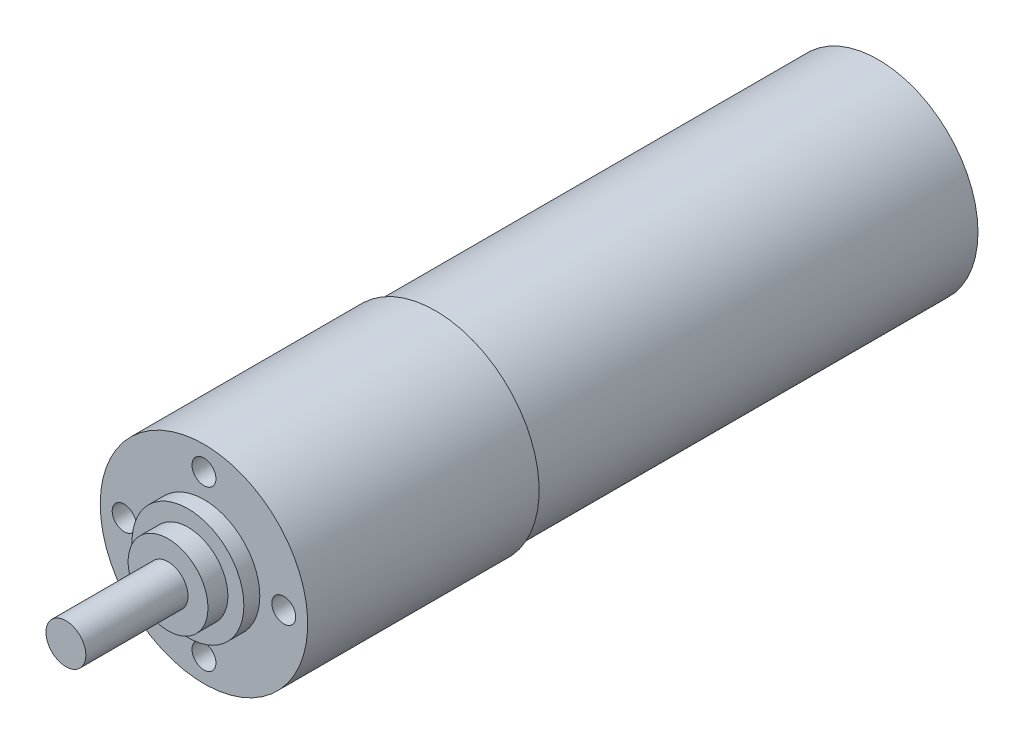
ISO-10303-21;
HEADER;
FILE_DESCRIPTION(('STEP AP214'),'2;1');
FILE_NAME('part.step','',(''),(''),'','','');
FILE_SCHEMA(('AUTOMOTIVE_DESIGN { 1 0 10303 214 1 1 1 1 }'));
ENDSEC;
DATA;
#1=APPLICATION_CONTEXT('core data for automotive mechanical design processes');
#2=APPLICATION_PROTOCOL_DEFINITION('international standard','automotive_design',2000,#1);
#3=PRODUCT_CONTEXT('',#1,'mechanical');
#4=PRODUCT('Part','Part','',(#3));
#5=PRODUCT_RELATED_PRODUCT_CATEGORY('part','',(#4));
#6=PRODUCT_DEFINITION_FORMATION('','',#4);
#7=PRODUCT_DEFINITION_CONTEXT('part definition',#1,'design');
#8=PRODUCT_DEFINITION('design','',#6,#7);
#9=PRODUCT_DEFINITION_SHAPE('','',#8);
#10=(LENGTH_UNIT() NAMED_UNIT(*) SI_UNIT(.MILLI.,.METRE.));
#11=(NAMED_UNIT(*) PLANE_ANGLE_UNIT() SI_UNIT($,.RADIAN.));
#12=(NAMED_UNIT(*) SI_UNIT($,.STERADIAN.) SOLID_ANGLE_UNIT());
#13=UNCERTAINTY_MEASURE_WITH_UNIT(LENGTH_MEASURE(1.E-05),#10,'distance_accuracy_value','');
#14=(GEOMETRIC_REPRESENTATION_CONTEXT(3) GLOBAL_UNCERTAINTY_ASSIGNED_CONTEXT((#13)) GLOBAL_UNIT_ASSIGNED_CONTEXT((#10,
#11,#12)) REPRESENTATION_CONTEXT('',''));
#15=CARTESIAN_POINT('',(0.,0.,0.));
#16=DIRECTION('',(0.,0.,1.));
#17=DIRECTION('',(1.,0.,0.));
#18=AXIS2_PLACEMENT_3D('',#15,#16,#17);
#19=CARTESIAN_POINT('',(0.,0.,89.));
#20=DIRECTION('',(0.,0.,1.));
#21=DIRECTION('',(1.,0.,0.));
#22=AXIS2_PLACEMENT_3D('',#19,#20,#21);
#23=PLANE('',#22);
#24=CARTESIAN_POINT('',(0.,0.,89.));
#25=DIRECTION('',(0.,0.,1.));
#26=DIRECTION('',(1.,0.,0.));
#27=AXIS2_PLACEMENT_3D('',#24,#25,#26);
#28=CIRCLE('',#27,5.);
#29=CARTESIAN_POINT('',(5.,0.,89.));
#30=VERTEX_POINT('',#29);
#31=EDGE_CURVE('E55',#30,#30,#28,.T.);
#32=ORIENTED_EDGE('',*,*,#31,.T.);
#33=EDGE_LOOP('',(#32));
#34=FACE_BOUND('',#33,.T.);
#35=CARTESIAN_POINT('',(0.,0.,89.));
#36=DIRECTION('',(0.,0.,1.));
#37=DIRECTION('',(1.,0.,0.));
#38=AXIS2_PLACEMENT_3D('',#35,#36,#37);
#39=CIRCLE('',#38,2.5);
#40=CARTESIAN_POINT('',(2.5,0.,89.));
#41=VERTEX_POINT('',#40);
#42=EDGE_CURVE('E64',#41,#41,#39,.T.);
#43=ORIENTED_EDGE('',*,*,#42,.F.);
#44=EDGE_LOOP('',(#43));
#45=FACE_BOUND('',#44,.T.);
#46=ADVANCED_FACE('F33',(#34,#45),#23,.T.);
#47=CARTESIAN_POINT('',(0.,0.,86.5));
#48=DIRECTION('',(0.,0.,1.));
#49=DIRECTION('',(1.,0.,0.));
#50=AXIS2_PLACEMENT_3D('',#47,#48,#49);
#51=PLANE('',#50);
#52=CARTESIAN_POINT('',(0.,0.,86.5));
#53=DIRECTION('',(0.,0.,1.));
#54=DIRECTION('',(1.,0.,0.));
#55=AXIS2_PLACEMENT_3D('',#52,#53,#54);
#56=CIRCLE('',#55,7.);
#57=CARTESIAN_POINT('',(7.,0.,86.5));
#58=VERTEX_POINT('',#57);
#59=EDGE_CURVE('E49',#58,#58,#56,.T.);
#60=ORIENTED_EDGE('',*,*,#59,.T.);
#61=EDGE_LOOP('',(#60));
#62=FACE_BOUND('',#61,.T.);
#63=CARTESIAN_POINT('',(0.,0.,86.5));
#64=DIRECTION('',(0.,0.,1.));
#65=DIRECTION('',(1.,0.,0.));
#66=AXIS2_PLACEMENT_3D('',#63,#64,#65);
#67=CIRCLE('',#66,5.);
#68=CARTESIAN_POINT('',(5.,0.,86.5));
#69=VERTEX_POINT('',#68);
#70=EDGE_CURVE('E58',#69,#69,#67,.T.);
#71=ORIENTED_EDGE('',*,*,#70,.F.);
#72=EDGE_LOOP('',(#71));
#73=FACE_BOUND('',#72,.T.);
#74=ADVANCED_FACE('F106',(#62,#73),#51,.T.);
#75=CARTESIAN_POINT('',(0.,0.,84.5));
#76=DIRECTION('',(0.,0.,1.));
#77=DIRECTION('',(1.,0.,0.));
#78=AXIS2_PLACEMENT_3D('',#75,#76,#77);
#79=PLANE('',#78);
#80=CARTESIAN_POINT('',(-9.99999999999972,-2.8421709430404E-13,84.5));
#81=DIRECTION('',(0.,0.,1.));
#82=DIRECTION('',(1.,0.,0.));
#83=AXIS2_PLACEMENT_3D('',#80,#81,#82);
#84=CIRCLE('',#83,1.50000000000045);
#85=CARTESIAN_POINT('',(-8.49999999999926,-2.8421709430404E-13,84.5));
#86=VERTEX_POINT('',#85);
#87=EDGE_CURVE('E88',#86,#86,#84,.T.);
#88=ORIENTED_EDGE('',*,*,#87,.F.);
#89=EDGE_LOOP('',(#88));
#90=FACE_BOUND('',#89,.T.);
#91=CARTESIAN_POINT('',(5.65984895009786E-13,-10.,84.5));
#92=DIRECTION('',(0.,0.,1.));
#93=DIRECTION('',(1.,0.,0.));
#94=AXIS2_PLACEMENT_3D('',#91,#92,#93);
#95=CIRCLE('',#94,1.50000000000061);
#96=CARTESIAN_POINT('',(1.50000000000117,-10.,84.5));
#97=VERTEX_POINT('',#96);
#98=EDGE_CURVE('E82',#97,#97,#95,.T.);
#99=ORIENTED_EDGE('',*,*,#98,.F.);
#100=EDGE_LOOP('',(#99));
#101=FACE_BOUND('',#100,.T.);
#102=CARTESIAN_POINT('',(10.0000000000003,2.82992447504893E-13,84.5));
#103=DIRECTION('',(0.,0.,1.));
#104=DIRECTION('',(1.,0.,0.));
#105=AXIS2_PLACEMENT_3D('',#102,#103,#104);
#106=CIRCLE('',#105,1.50000000000022);
#107=CARTESIAN_POINT('',(11.5000000000005,2.82992447504893E-13,84.5));
#108=VERTEX_POINT('',#107);
#109=EDGE_CURVE('E76',#108,#108,#106,.T.);
#110=ORIENTED_EDGE('',*,*,#109,.F.);
#111=EDGE_LOOP('',(#110));
#112=FACE_BOUND('',#111,.T.);
#113=CARTESIAN_POINT('',(0.,10.,84.5));
#114=DIRECTION('',(0.,0.,1.));
#115=DIRECTION('',(1.,0.,0.));
#116=AXIS2_PLACEMENT_3D('',#113,#114,#115);
#117=CIRCLE('',#116,1.5);
#118=CARTESIAN_POINT('',(1.5,10.,84.5));
#119=VERTEX_POINT('',#118);
#120=EDGE_CURVE('E70',#119,#119,#117,.T.);
#121=ORIENTED_EDGE('',*,*,#120,.F.);
#122=EDGE_LOOP('',(#121));
#123=FACE_BOUND('',#122,.T.);
#124=CARTESIAN_POINT('',(0.,0.,84.5));
#125=DIRECTION('',(0.,0.,1.));
#126=DIRECTION('',(1.,0.,0.));
#127=AXIS2_PLACEMENT_3D('',#124,#125,#126);
#128=CIRCLE('',#127,13.);
#129=CARTESIAN_POINT('',(-13.,0.,84.5));
#130=VERTEX_POINT('',#129);
#131=EDGE_CURVE('E44',#130,#130,#128,.T.);
#132=ORIENTED_EDGE('',*,*,#131,.T.);
#133=EDGE_LOOP('',(#132));
#134=FACE_BOUND('',#133,.T.);
#135=CARTESIAN_POINT('',(0.,0.,84.5));
#136=DIRECTION('',(0.,0.,1.));
#137=DIRECTION('',(1.,0.,0.));
#138=AXIS2_PLACEMENT_3D('',#135,#136,#137);
#139=CIRCLE('',#138,7.);
#140=CARTESIAN_POINT('',(7.,0.,84.5));
#141=VERTEX_POINT('',#140);
#142=EDGE_CURVE('E52',#141,#141,#139,.T.);
#143=ORIENTED_EDGE('',*,*,#142,.F.);
#144=EDGE_LOOP('',(#143));
#145=FACE_BOUND('',#144,.T.);
#146=ADVANCED_FACE('F103',(#90,#101,#112,#123,#134,#145),#79,.T.);
#147=CARTESIAN_POINT('',(0.,0.,55.5));
#148=DIRECTION('',(0.,0.,-1.));
#149=DIRECTION('',(-1.,0.,0.));
#150=AXIS2_PLACEMENT_3D('',#147,#148,#149);
#151=CYLINDRICAL_SURFACE('',#150,12.5);
#152=CARTESIAN_POINT('',(0.,0.,55.5));
#153=DIRECTION('',(0.,0.,1.));
#154=DIRECTION('',(1.,0.,0.));
#155=AXIS2_PLACEMENT_3D('',#152,#153,#154);
#156=CIRCLE('',#155,12.5);
#157=CARTESIAN_POINT('',(12.5,0.,55.5));
#158=VERTEX_POINT('',#157);
#159=EDGE_CURVE('E10',#158,#158,#156,.T.);
#160=ORIENTED_EDGE('',*,*,#159,.F.);
#161=EDGE_LOOP('',(#160));
#162=FACE_BOUND('',#161,.T.);
#163=CARTESIAN_POINT('',(0.,0.,0.));
#164=DIRECTION('',(0.,0.,1.));
#165=DIRECTION('',(1.,0.,0.));
#166=AXIS2_PLACEMENT_3D('',#163,#164,#165);
#167=CIRCLE('',#166,12.5);
#168=CARTESIAN_POINT('',(12.5,0.,0.));
#169=VERTEX_POINT('',#168);
#170=EDGE_CURVE('E37',#169,#169,#167,.T.);
#171=ORIENTED_EDGE('',*,*,#170,.T.);
#172=EDGE_LOOP('',(#171));
#173=FACE_BOUND('',#172,.T.);
#174=ADVANCED_FACE('F35',(#162,#173),#151,.T.);
#175=CARTESIAN_POINT('',(0.,0.,0.));
#176=DIRECTION('',(0.,0.,1.));
#177=DIRECTION('',(1.,0.,0.));
#178=AXIS2_PLACEMENT_3D('',#175,#176,#177);
#179=PLANE('',#178);
#180=ORIENTED_EDGE('',*,*,#170,.F.);
#181=EDGE_LOOP('',(#180));
#182=FACE_BOUND('',#181,.T.);
#183=ADVANCED_FACE('F269',(#182),#179,.F.);
#184=CARTESIAN_POINT('',(0.,0.,55.5));
#185=DIRECTION('',(0.,0.,1.));
#186=DIRECTION('',(1.,0.,0.));
#187=AXIS2_PLACEMENT_3D('',#184,#185,#186);
#188=PLANE('',#187);
#189=CARTESIAN_POINT('',(0.,0.,55.5));
#190=DIRECTION('',(0.,0.,1.));
#191=DIRECTION('',(1.,0.,0.));
#192=AXIS2_PLACEMENT_3D('',#189,#190,#191);
#193=CIRCLE('',#192,13.);
#194=CARTESIAN_POINT('',(-13.,0.,55.5));
#195=VERTEX_POINT('',#194);
#196=EDGE_CURVE('E46',#195,#195,#193,.T.);
#197=ORIENTED_EDGE('',*,*,#196,.F.);
#198=EDGE_LOOP('',(#197));
#199=FACE_BOUND('',#198,.T.);
#200=ORIENTED_EDGE('',*,*,#159,.T.);
#201=EDGE_LOOP('',(#200));
#202=FACE_BOUND('',#201,.T.);
#203=ADVANCED_FACE('F131',(#199,#202),#188,.F.);
#204=CARTESIAN_POINT('',(0.,0.,84.5));
#205=DIRECTION('',(0.,0.,-1.));
#206=DIRECTION('',(-1.,0.,0.));
#207=AXIS2_PLACEMENT_3D('',#204,#205,#206);
#208=CYLINDRICAL_SURFACE('',#207,13.);
#209=CARTESIAN_POINT('',(-13.,0.,84.5));
#210=CARTESIAN_POINT('',(-13.,0.,84.1979166666667));
#211=CARTESIAN_POINT('',(-13.,0.,83.8958333333333));
#212=CARTESIAN_POINT('',(-13.,0.,83.2916666666667));
#213=CARTESIAN_POINT('',(-13.,0.,82.9895833333333));
#214=CARTESIAN_POINT('',(-13.,0.,82.3854166666667));
#215=CARTESIAN_POINT('',(-13.,0.,82.0833333333333));
#216=CARTESIAN_POINT('',(-13.,0.,81.4791666666667));
#217=CARTESIAN_POINT('',(-13.,0.,81.1770833333333));
#218=CARTESIAN_POINT('',(-13.,0.,80.5729166666667));
#219=CARTESIAN_POINT('',(-13.,0.,80.2708333333333));
#220=CARTESIAN_POINT('',(-13.,0.,79.6666666666667));
#221=CARTESIAN_POINT('',(-13.,0.,79.3645833333333));
#222=CARTESIAN_POINT('',(-13.,0.,78.7604166666667));
#223=CARTESIAN_POINT('',(-13.,0.,78.4583333333333));
#224=CARTESIAN_POINT('',(-13.,0.,77.8541666666667));
#225=CARTESIAN_POINT('',(-13.,0.,77.5520833333333));
#226=CARTESIAN_POINT('',(-13.,0.,76.9479166666667));
#227=CARTESIAN_POINT('',(-13.,0.,76.6458333333333));
#228=CARTESIAN_POINT('',(-13.,0.,76.0416666666667));
#229=CARTESIAN_POINT('',(-13.,0.,75.7395833333333));
#230=CARTESIAN_POINT('',(-13.,0.,75.1354166666667));
#231=CARTESIAN_POINT('',(-13.,0.,74.8333333333333));
#232=CARTESIAN_POINT('',(-13.,0.,74.2291666666667));
#233=CARTESIAN_POINT('',(-13.,0.,73.9270833333333));
#234=CARTESIAN_POINT('',(-13.,0.,73.3229166666667));
#235=CARTESIAN_POINT('',(-13.,0.,73.0208333333333));
#236=CARTESIAN_POINT('',(-13.,0.,72.4166666666667));
#237=CARTESIAN_POINT('',(-13.,0.,72.1145833333333));
#238=CARTESIAN_POINT('',(-13.,0.,71.5104166666667));
#239=CARTESIAN_POINT('',(-13.,0.,71.2083333333333));
#240=CARTESIAN_POINT('',(-13.,0.,70.6041666666667));
#241=CARTESIAN_POINT('',(-13.,0.,70.3020833333333));
#242=CARTESIAN_POINT('',(-13.,0.,69.6979166666667));
#243=CARTESIAN_POINT('',(-13.,0.,69.3958333333333));
#244=CARTESIAN_POINT('',(-13.,0.,68.7916666666667));
#245=CARTESIAN_POINT('',(-13.,0.,68.4895833333333));
#246=CARTESIAN_POINT('',(-13.,0.,67.8854166666667));
#247=CARTESIAN_POINT('',(-13.,0.,67.5833333333333));
#248=CARTESIAN_POINT('',(-13.,0.,66.9791666666667));
#249=CARTESIAN_POINT('',(-13.,0.,66.6770833333333));
#250=CARTESIAN_POINT('',(-13.,0.,66.0729166666667));
#251=CARTESIAN_POINT('',(-13.,0.,65.7708333333333));
#252=CARTESIAN_POINT('',(-13.,0.,65.1666666666667));
#253=CARTESIAN_POINT('',(-13.,0.,64.8645833333333));
#254=CARTESIAN_POINT('',(-13.,0.,64.2604166666667));
#255=CARTESIAN_POINT('',(-13.,0.,63.9583333333333));
#256=CARTESIAN_POINT('',(-13.,0.,63.3541666666667));
#257=CARTESIAN_POINT('',(-13.,0.,63.0520833333333));
#258=CARTESIAN_POINT('',(-13.,0.,62.4479166666667));
#259=CARTESIAN_POINT('',(-13.,0.,62.1458333333333));
#260=CARTESIAN_POINT('',(-13.,0.,61.5416666666667));
#261=CARTESIAN_POINT('',(-13.,0.,61.2395833333333));
#262=CARTESIAN_POINT('',(-13.,0.,60.6354166666667));
#263=CARTESIAN_POINT('',(-13.,0.,60.3333333333333));
#264=CARTESIAN_POINT('',(-13.,0.,59.7291666666667));
#265=CARTESIAN_POINT('',(-13.,0.,59.4270833333333));
#266=CARTESIAN_POINT('',(-13.,0.,58.8229166666667));
#267=CARTESIAN_POINT('',(-13.,0.,58.5208333333333));
#268=CARTESIAN_POINT('',(-13.,0.,57.9166666666667));
#269=CARTESIAN_POINT('',(-13.,0.,57.6145833333333));
#270=CARTESIAN_POINT('',(-13.,0.,57.0104166666667));
#271=CARTESIAN_POINT('',(-13.,0.,56.7083333333333));
#272=CARTESIAN_POINT('',(-13.,0.,56.1041666666667));
#273=CARTESIAN_POINT('',(-13.,0.,55.8020833333333));
#274=CARTESIAN_POINT('',(-13.,0.,55.5));
#275=B_SPLINE_CURVE_WITH_KNOTS('',3,(#209,#210,#211,#212,#213,#214,#215,#216,#217,#218,#219,
#220,#221,#222,#223,#224,#225,#226,#227,#228,#229,#230,#231,#232,#233,#234,#235,#236,#237,#238,
#239,#240,#241,#242,#243,#244,#245,#246,#247,#248,#249,#250,#251,#252,#253,#254,#255,#256,#257,
#258,#259,#260,#261,#262,#263,#264,#265,#266,#267,#268,#269,#270,#271,#272,#273,#274),
.UNSPECIFIED.,.F.,.F.,(4,2,2,2,2,2,2,2,2,2,2,2,2,2,2,2,2,2,2,2,2,2,2,2,2,2,2,2,2,2,2,2,4),(0.,
0.906249999999997,1.81249999999999,2.71874999999999,3.62499999999999,4.53124999999999,5.4375,
6.34375,7.24999999999999,8.15624999999999,9.06249999999999,9.96875,10.875,11.78125,12.6875,
13.59375,14.5,15.40625,16.3125,17.21875,18.125,19.03125,19.9375,20.84375,21.75,22.65625,23.5625,
24.46875,25.375,26.28125,27.1875,28.09375,29.),.UNSPECIFIED.);
#276=EDGE_CURVE('BSEAM121',#130,#195,#275,.T.);
#277=ORIENTED_EDGE('',*,*,#131,.F.);
#278=ORIENTED_EDGE('',*,*,#196,.T.);
#279=ORIENTED_EDGE('',*,*,#276,.T.);
#280=ORIENTED_EDGE('',*,*,#276,.F.);
#281=EDGE_LOOP('',(#277,#279,#278,#280));
#282=FACE_BOUND('',#281,.T.);
#283=ADVANCED_FACE('F121',(#282),#208,.T.);
#284=CARTESIAN_POINT('',(0.,0.,86.5));
#285=DIRECTION('',(0.,0.,-1.));
#286=DIRECTION('',(-1.,0.,0.));
#287=AXIS2_PLACEMENT_3D('',#284,#285,#286);
#288=CYLINDRICAL_SURFACE('',#287,7.);
#289=ORIENTED_EDGE('',*,*,#59,.F.);
#290=EDGE_LOOP('',(#289));
#291=FACE_BOUND('',#290,.T.);
#292=ORIENTED_EDGE('',*,*,#142,.T.);
#293=EDGE_LOOP('',(#292));
#294=FACE_BOUND('',#293,.T.);
#295=ADVANCED_FACE('F118',(#291,#294),#288,.T.);
#296=CARTESIAN_POINT('',(0.,0.,89.));
#297=DIRECTION('',(0.,0.,-1.));
#298=DIRECTION('',(-1.,0.,0.));
#299=AXIS2_PLACEMENT_3D('',#296,#297,#298);
#300=CYLINDRICAL_SURFACE('',#299,5.);
#301=ORIENTED_EDGE('',*,*,#31,.F.);
#302=EDGE_LOOP('',(#301));
#303=FACE_BOUND('',#302,.T.);
#304=ORIENTED_EDGE('',*,*,#70,.T.);
#305=EDGE_LOOP('',(#304));
#306=FACE_BOUND('',#305,.T.);
#307=ADVANCED_FACE('F120',(#303,#306),#300,.T.);
#308=CARTESIAN_POINT('',(0.,0.,101.8));
#309=DIRECTION('',(0.,0.,-1.));
#310=DIRECTION('',(-1.,0.,0.));
#311=AXIS2_PLACEMENT_3D('',#308,#309,#310);
#312=CYLINDRICAL_SURFACE('',#311,2.5);
#313=CARTESIAN_POINT('',(0.,0.,101.8));
#314=DIRECTION('',(0.,0.,1.));
#315=DIRECTION('',(1.,0.,0.));
#316=AXIS2_PLACEMENT_3D('',#313,#314,#315);
#317=CIRCLE('',#316,2.5);
#318=CARTESIAN_POINT('',(2.5,0.,101.8));
#319=VERTEX_POINT('',#318);
#320=EDGE_CURVE('E61',#319,#319,#317,.T.);
#321=ORIENTED_EDGE('',*,*,#320,.F.);
#322=EDGE_LOOP('',(#321));
#323=FACE_BOUND('',#322,.T.);
#324=ORIENTED_EDGE('',*,*,#42,.T.);
#325=EDGE_LOOP('',(#324));
#326=FACE_BOUND('',#325,.T.);
#327=ADVANCED_FACE('F128',(#323,#326),#312,.T.);
#328=CARTESIAN_POINT('',(0.,0.,101.8));
#329=DIRECTION('',(0.,0.,1.));
#330=DIRECTION('',(1.,0.,0.));
#331=AXIS2_PLACEMENT_3D('',#328,#329,#330);
#332=PLANE('',#331);
#333=ORIENTED_EDGE('',*,*,#320,.T.);
#334=EDGE_LOOP('',(#333));
#335=FACE_BOUND('',#334,.T.);
#336=ADVANCED_FACE('F147',(#335),#332,.T.);
#337=CARTESIAN_POINT('',(0.,10.,80.5));
#338=DIRECTION('',(0.,0.,1.));
#339=DIRECTION('',(1.,0.,0.));
#340=AXIS2_PLACEMENT_3D('',#337,#338,#339);
#341=CYLINDRICAL_SURFACE('',#340,1.5);
#342=CARTESIAN_POINT('',(0.,10.,80.5));
#343=DIRECTION('',(0.,0.,1.));
#344=DIRECTION('',(1.,0.,0.));
#345=AXIS2_PLACEMENT_3D('',#342,#343,#344);
#346=CIRCLE('',#345,1.5);
#347=CARTESIAN_POINT('',(1.5,10.,80.5));
#348=VERTEX_POINT('',#347);
#349=EDGE_CURVE('E67',#348,#348,#346,.T.);
#350=ORIENTED_EDGE('',*,*,#349,.F.);
#351=EDGE_LOOP('',(#350));
#352=FACE_BOUND('',#351,.T.);
#353=ORIENTED_EDGE('',*,*,#120,.T.);
#354=EDGE_LOOP('',(#353));
#355=FACE_BOUND('',#354,.T.);
#356=ADVANCED_FACE('F151',(#352,#355),#341,.F.);
#357=CARTESIAN_POINT('',(0.,10.,80.5));
#358=DIRECTION('',(0.,0.,1.));
#359=DIRECTION('',(1.,0.,0.));
#360=AXIS2_PLACEMENT_3D('',#357,#358,#359);
#361=PLANE('',#360);
#362=ORIENTED_EDGE('',*,*,#349,.T.);
#363=EDGE_LOOP('',(#362));
#364=FACE_BOUND('',#363,.T.);
#365=ADVANCED_FACE('F155',(#364),#361,.T.);
#366=CARTESIAN_POINT('',(10.0000000000003,2.82992447504893E-13,80.5));
#367=DIRECTION('',(0.,0.,1.));
#368=DIRECTION('',(1.,0.,0.));
#369=AXIS2_PLACEMENT_3D('',#366,#367,#368);
#370=CYLINDRICAL_SURFACE('',#369,1.50000000000022);
#371=CARTESIAN_POINT('',(10.0000000000003,2.82992447504893E-13,80.5));
#372=DIRECTION('',(0.,0.,1.));
#373=DIRECTION('',(1.,0.,0.));
#374=AXIS2_PLACEMENT_3D('',#371,#372,#373);
#375=CIRCLE('',#374,1.50000000000022);
#376=CARTESIAN_POINT('',(11.5000000000005,2.82992447504893E-13,80.5));
#377=VERTEX_POINT('',#376);
#378=EDGE_CURVE('E73',#377,#377,#375,.T.);
#379=ORIENTED_EDGE('',*,*,#378,.F.);
#380=EDGE_LOOP('',(#379));
#381=FACE_BOUND('',#380,.T.);
#382=ORIENTED_EDGE('',*,*,#109,.T.);
#383=EDGE_LOOP('',(#382));
#384=FACE_BOUND('',#383,.T.);
#385=ADVANCED_FACE('F159',(#381,#384),#370,.F.);
#386=CARTESIAN_POINT('',(10.0000000000003,2.82992447504893E-13,80.5));
#387=DIRECTION('',(0.,0.,1.));
#388=DIRECTION('',(1.,0.,0.));
#389=AXIS2_PLACEMENT_3D('',#386,#387,#388);
#390=PLANE('',#389);
#391=ORIENTED_EDGE('',*,*,#378,.T.);
#392=EDGE_LOOP('',(#391));
#393=FACE_BOUND('',#392,.T.);
#394=ADVANCED_FACE('F163',(#393),#390,.T.);
#395=CARTESIAN_POINT('',(5.65984895009786E-13,-10.,80.5));
#396=DIRECTION('',(0.,0.,1.));
#397=DIRECTION('',(1.,0.,0.));
#398=AXIS2_PLACEMENT_3D('',#395,#396,#397);
#399=CYLINDRICAL_SURFACE('',#398,1.50000000000061);
#400=CARTESIAN_POINT('',(5.65984895009786E-13,-10.,80.5));
#401=DIRECTION('',(0.,0.,1.));
#402=DIRECTION('',(1.,0.,0.));
#403=AXIS2_PLACEMENT_3D('',#400,#401,#402);
#404=CIRCLE('',#403,1.50000000000061);
#405=CARTESIAN_POINT('',(1.50000000000117,-10.,80.5));
#406=VERTEX_POINT('',#405);
#407=EDGE_CURVE('E79',#406,#406,#404,.T.);
#408=ORIENTED_EDGE('',*,*,#407,.F.);
#409=EDGE_LOOP('',(#408));
#410=FACE_BOUND('',#409,.T.);
#411=ORIENTED_EDGE('',*,*,#98,.T.);
#412=EDGE_LOOP('',(#411));
#413=FACE_BOUND('',#412,.T.);
#414=ADVANCED_FACE('F167',(#410,#413),#399,.F.);
#415=CARTESIAN_POINT('',(5.65984895009786E-13,-10.,80.5));
#416=DIRECTION('',(0.,0.,1.));
#417=DIRECTION('',(1.,0.,0.));
#418=AXIS2_PLACEMENT_3D('',#415,#416,#417);
#419=PLANE('',#418);
#420=ORIENTED_EDGE('',*,*,#407,.T.);
#421=EDGE_LOOP('',(#420));
#422=FACE_BOUND('',#421,.T.);
#423=ADVANCED_FACE('F99',(#422),#419,.T.);
#424=CARTESIAN_POINT('',(-9.99999999999972,-2.8421709430404E-13,80.5));
#425=DIRECTION('',(0.,0.,1.));
#426=DIRECTION('',(1.,0.,0.));
#427=AXIS2_PLACEMENT_3D('',#424,#425,#426);
#428=CYLINDRICAL_SURFACE('',#427,1.50000000000045);
#429=CARTESIAN_POINT('',(-9.99999999999972,-2.8421709430404E-13,80.5));
#430=DIRECTION('',(0.,0.,1.));
#431=DIRECTION('',(1.,0.,0.));
#432=AXIS2_PLACEMENT_3D('',#429,#430,#431);
#433=CIRCLE('',#432,1.50000000000045);
#434=CARTESIAN_POINT('',(-8.49999999999926,-2.8421709430404E-13,80.5));
#435=VERTEX_POINT('',#434);
#436=EDGE_CURVE('E85',#435,#435,#433,.T.);
#437=ORIENTED_EDGE('',*,*,#436,.F.);
#438=EDGE_LOOP('',(#437));
#439=FACE_BOUND('',#438,.T.);
#440=ORIENTED_EDGE('',*,*,#87,.T.);
#441=EDGE_LOOP('',(#440));
#442=FACE_BOUND('',#441,.T.);
#443=ADVANCED_FACE('F96',(#439,#442),#428,.F.);
#444=CARTESIAN_POINT('',(-9.99999999999972,-2.8421709430404E-13,80.5));
#445=DIRECTION('',(0.,0.,1.));
#446=DIRECTION('',(1.,0.,0.));
#447=AXIS2_PLACEMENT_3D('',#444,#445,#446);
#448=PLANE('',#447);
#449=ORIENTED_EDGE('',*,*,#436,.T.);
#450=EDGE_LOOP('',(#449));
#451=FACE_BOUND('',#450,.T.);
#452=ADVANCED_FACE('F94',(#451),#448,.T.);
#453=CLOSED_SHELL('',(#46,#74,#146,#174,#183,#203,#283,#295,#307,#327,#336,#356,#365,#385,#394,
#414,#423,#443,#452));
#454=MANIFOLD_SOLID_BREP('B2',#453);
#455=ADVANCED_BREP_SHAPE_REPRESENTATION('',(#18,#454),#14);
#456=SHAPE_DEFINITION_REPRESENTATION(#9,#455);
ENDSEC;
END-ISO-10303-21;
